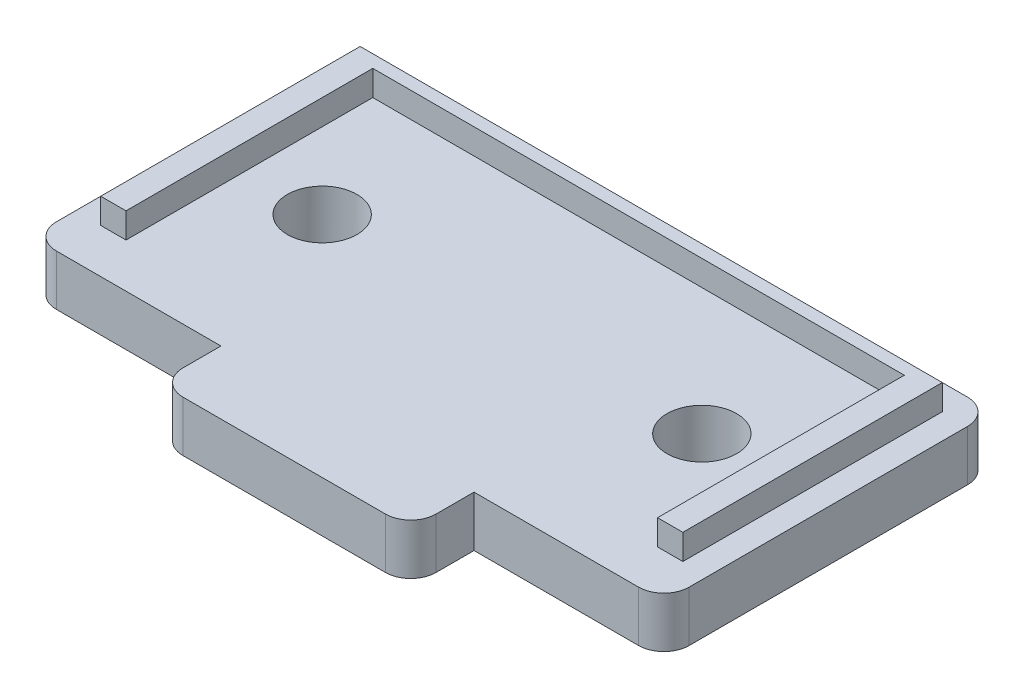
ISO-10303-21;
HEADER;
FILE_DESCRIPTION(('STEP AP214'),'2;1');
FILE_NAME('part.step','',(''),(''),'','','');
FILE_SCHEMA(('AUTOMOTIVE_DESIGN { 1 0 10303 214 1 1 1 1 }'));
ENDSEC;
DATA;
#1=APPLICATION_CONTEXT('core data for automotive mechanical design processes');
#2=APPLICATION_PROTOCOL_DEFINITION('international standard','automotive_design',2000,#1);
#3=PRODUCT_CONTEXT('',#1,'mechanical');
#4=PRODUCT('Part','Part','',(#3));
#5=PRODUCT_RELATED_PRODUCT_CATEGORY('part','',(#4));
#6=PRODUCT_DEFINITION_FORMATION('','',#4);
#7=PRODUCT_DEFINITION_CONTEXT('part definition',#1,'design');
#8=PRODUCT_DEFINITION('design','',#6,#7);
#9=PRODUCT_DEFINITION_SHAPE('','',#8);
#10=(LENGTH_UNIT() NAMED_UNIT(*) SI_UNIT(.MILLI.,.METRE.));
#11=(NAMED_UNIT(*) PLANE_ANGLE_UNIT() SI_UNIT($,.RADIAN.));
#12=(NAMED_UNIT(*) SI_UNIT($,.STERADIAN.) SOLID_ANGLE_UNIT());
#13=UNCERTAINTY_MEASURE_WITH_UNIT(LENGTH_MEASURE(1.E-05),#10,'distance_accuracy_value','');
#14=(GEOMETRIC_REPRESENTATION_CONTEXT(3) GLOBAL_UNCERTAINTY_ASSIGNED_CONTEXT((#13)) GLOBAL_UNIT_ASSIGNED_CONTEXT((#10,
#11,#12)) REPRESENTATION_CONTEXT('',''));
#15=CARTESIAN_POINT('',(0.,0.,0.));
#16=DIRECTION('',(0.,0.,1.));
#17=DIRECTION('',(1.,0.,0.));
#18=AXIS2_PLACEMENT_3D('',#15,#16,#17);
#19=CARTESIAN_POINT('',(0.,4.,0.));
#20=DIRECTION('',(0.,-1.,0.));
#21=DIRECTION('',(0.,0.,-1.));
#22=AXIS2_PLACEMENT_3D('',#19,#20,#21);
#23=PLANE('',#22);
#24=DIRECTION('',(0.,0.,1.));
#25=VECTOR('',#24,1.);
#26=CARTESIAN_POINT('',(-10.,4.,13.));
#27=LINE('',#26,#25);
#28=CARTESIAN_POINT('',(-10.,4.,13.));
#29=VERTEX_POINT('',#28);
#30=CARTESIAN_POINT('',(-10.,4.,16.));
#31=VERTEX_POINT('',#30);
#32=EDGE_CURVE('E250',#29,#31,#27,.T.);
#33=ORIENTED_EDGE('',*,*,#32,.T.);
#34=CARTESIAN_POINT('',(-8.,4.,16.));
#35=DIRECTION('',(0.,-1.,0.));
#36=DIRECTION('',(0.,0.,-1.));
#37=AXIS2_PLACEMENT_3D('',#34,#35,#36);
#38=CIRCLE('',#37,2.);
#39=CARTESIAN_POINT('',(-8.,4.,18.));
#40=VERTEX_POINT('',#39);
#41=EDGE_CURVE('E313',#31,#40,#38,.F.);
#42=ORIENTED_EDGE('',*,*,#41,.T.);
#43=DIRECTION('',(1.,0.,0.));
#44=VECTOR('',#43,1.);
#45=CARTESIAN_POINT('',(-10.,4.,18.));
#46=LINE('',#45,#44);
#47=CARTESIAN_POINT('',(8.,4.,18.));
#48=VERTEX_POINT('',#47);
#49=EDGE_CURVE('E253',#40,#48,#46,.T.);
#50=ORIENTED_EDGE('',*,*,#49,.T.);
#51=CARTESIAN_POINT('',(8.,4.,16.));
#52=DIRECTION('',(0.,-1.,0.));
#53=DIRECTION('',(0.,0.,-1.));
#54=AXIS2_PLACEMENT_3D('',#51,#52,#53);
#55=CIRCLE('',#54,2.);
#56=CARTESIAN_POINT('',(10.,4.,16.));
#57=VERTEX_POINT('',#56);
#58=EDGE_CURVE('E311',#48,#57,#55,.F.);
#59=ORIENTED_EDGE('',*,*,#58,.T.);
#60=DIRECTION('',(0.,0.,-1.));
#61=VECTOR('',#60,1.);
#62=CARTESIAN_POINT('',(10.,4.,13.));
#63=LINE('',#62,#61);
#64=CARTESIAN_POINT('',(10.,4.,13.));
#65=VERTEX_POINT('',#64);
#66=EDGE_CURVE('E256',#57,#65,#63,.T.);
#67=ORIENTED_EDGE('',*,*,#66,.T.);
#68=DIRECTION('',(1.,0.,0.));
#69=VECTOR('',#68,1.);
#70=CARTESIAN_POINT('',(10.,4.,13.));
#71=LINE('',#70,#69);
#72=CARTESIAN_POINT('',(23.,4.,13.));
#73=VERTEX_POINT('',#72);
#74=EDGE_CURVE('E235',#65,#73,#71,.T.);
#75=ORIENTED_EDGE('',*,*,#74,.T.);
#76=CARTESIAN_POINT('',(23.,4.,11.));
#77=DIRECTION('',(0.,-1.,0.));
#78=DIRECTION('',(0.,0.,-1.));
#79=AXIS2_PLACEMENT_3D('',#76,#77,#78);
#80=CIRCLE('',#79,2.);
#81=CARTESIAN_POINT('',(25.,4.,11.));
#82=VERTEX_POINT('',#81);
#83=EDGE_CURVE('E309',#73,#82,#80,.F.);
#84=ORIENTED_EDGE('',*,*,#83,.T.);
#85=DIRECTION('',(0.,0.,-1.));
#86=VECTOR('',#85,1.);
#87=CARTESIAN_POINT('',(25.,4.,-13.));
#88=LINE('',#87,#86);
#89=CARTESIAN_POINT('',(25.,4.,-11.));
#90=VERTEX_POINT('',#89);
#91=EDGE_CURVE('E238',#82,#90,#88,.T.);
#92=ORIENTED_EDGE('',*,*,#91,.T.);
#93=CARTESIAN_POINT('',(23.,4.,-11.));
#94=DIRECTION('',(0.,-1.,0.));
#95=DIRECTION('',(0.,0.,-1.));
#96=AXIS2_PLACEMENT_3D('',#93,#94,#95);
#97=CIRCLE('',#96,2.);
#98=CARTESIAN_POINT('',(23.,4.,-13.));
#99=VERTEX_POINT('',#98);
#100=EDGE_CURVE('E305',#90,#99,#97,.F.);
#101=ORIENTED_EDGE('',*,*,#100,.T.);
#102=DIRECTION('',(-1.,0.,0.));
#103=VECTOR('',#102,1.);
#104=CARTESIAN_POINT('',(-25.,4.,-13.));
#105=LINE('',#104,#103);
#106=CARTESIAN_POINT('',(-23.,4.,-13.));
#107=VERTEX_POINT('',#106);
#108=EDGE_CURVE('E242',#99,#107,#105,.T.);
#109=ORIENTED_EDGE('',*,*,#108,.T.);
#110=CARTESIAN_POINT('',(-23.,4.,-11.));
#111=DIRECTION('',(0.,-1.,0.));
#112=DIRECTION('',(0.,0.,-1.));
#113=AXIS2_PLACEMENT_3D('',#110,#111,#112);
#114=CIRCLE('',#113,2.);
#115=CARTESIAN_POINT('',(-25.,4.,-11.));
#116=VERTEX_POINT('',#115);
#117=EDGE_CURVE('E307',#107,#116,#114,.F.);
#118=ORIENTED_EDGE('',*,*,#117,.T.);
#119=DIRECTION('',(0.,0.,1.));
#120=VECTOR('',#119,1.);
#121=CARTESIAN_POINT('',(-25.,4.,-13.));
#122=LINE('',#121,#120);
#123=CARTESIAN_POINT('',(-25.,4.,11.));
#124=VERTEX_POINT('',#123);
#125=EDGE_CURVE('E245',#116,#124,#122,.T.);
#126=ORIENTED_EDGE('',*,*,#125,.T.);
#127=CARTESIAN_POINT('',(-23.,4.,11.));
#128=DIRECTION('',(0.,-1.,0.));
#129=DIRECTION('',(0.,0.,-1.));
#130=AXIS2_PLACEMENT_3D('',#127,#128,#129);
#131=CIRCLE('',#130,2.);
#132=CARTESIAN_POINT('',(-23.,4.,13.));
#133=VERTEX_POINT('',#132);
#134=EDGE_CURVE('E303',#124,#133,#131,.F.);
#135=ORIENTED_EDGE('',*,*,#134,.T.);
#136=DIRECTION('',(1.,0.,0.));
#137=VECTOR('',#136,1.);
#138=CARTESIAN_POINT('',(-25.,4.,13.));
#139=LINE('',#138,#137);
#140=EDGE_CURVE('E248',#133,#29,#139,.T.);
#141=ORIENTED_EDGE('',*,*,#140,.T.);
#142=EDGE_LOOP('',(#33,#42,#50,#59,#67,#75,#84,#92,#101,#109,#118,#126,#135,#141));
#143=FACE_BOUND('',#142,.T.);
#144=CARTESIAN_POINT('',(15.,4.,0.));
#145=DIRECTION('',(0.,1.,0.));
#146=DIRECTION('',(0.,0.,-1.));
#147=AXIS2_PLACEMENT_3D('',#144,#145,#146);
#148=CIRCLE('',#147,2.75);
#149=CARTESIAN_POINT('',(15.,4.,-2.75));
#150=VERTEX_POINT('',#149);
#151=EDGE_CURVE('E217',#150,#150,#148,.T.);
#152=ORIENTED_EDGE('',*,*,#151,.F.);
#153=EDGE_LOOP('',(#152));
#154=FACE_BOUND('',#153,.T.);
#155=CARTESIAN_POINT('',(-15.,4.,0.));
#156=DIRECTION('',(0.,1.,0.));
#157=DIRECTION('',(0.,0.,1.));
#158=AXIS2_PLACEMENT_3D('',#155,#156,#157);
#159=CIRCLE('',#158,2.75);
#160=CARTESIAN_POINT('',(-15.,4.,2.75));
#161=VERTEX_POINT('',#160);
#162=EDGE_CURVE('E226',#161,#161,#159,.T.);
#163=ORIENTED_EDGE('',*,*,#162,.F.);
#164=EDGE_LOOP('',(#163));
#165=FACE_BOUND('',#164,.T.);
#166=DIRECTION('',(1.,0.,0.));
#167=VECTOR('',#166,1.);
#168=CARTESIAN_POINT('',(23.,4.,9.5));
#169=LINE('',#168,#167);
#170=CARTESIAN_POINT('',(21.,4.,9.5));
#171=VERTEX_POINT('',#170);
#172=CARTESIAN_POINT('',(23.,4.,9.5));
#173=VERTEX_POINT('',#172);
#174=EDGE_CURVE('E216',#171,#173,#169,.T.);
#175=ORIENTED_EDGE('',*,*,#174,.F.);
#176=DIRECTION('',(0.,0.,1.));
#177=VECTOR('',#176,1.);
#178=CARTESIAN_POINT('',(21.,4.,9.5));
#179=LINE('',#178,#177);
#180=CARTESIAN_POINT('',(21.,4.,-10.));
#181=VERTEX_POINT('',#180);
#182=EDGE_CURVE('E213',#181,#171,#179,.T.);
#183=ORIENTED_EDGE('',*,*,#182,.F.);
#184=DIRECTION('',(1.,0.,0.));
#185=VECTOR('',#184,1.);
#186=CARTESIAN_POINT('',(-8.5,4.,-10.));
#187=LINE('',#186,#185);
#188=CARTESIAN_POINT('',(-21.,4.,-10.));
#189=VERTEX_POINT('',#188);
#190=EDGE_CURVE('E583',#189,#181,#187,.T.);
#191=ORIENTED_EDGE('',*,*,#190,.F.);
#192=DIRECTION('',(0.,0.,-1.));
#193=VECTOR('',#192,1.);
#194=CARTESIAN_POINT('',(-21.,4.,-10.));
#195=LINE('',#194,#193);
#196=CARTESIAN_POINT('',(-21.,4.,9.5));
#197=VERTEX_POINT('',#196);
#198=EDGE_CURVE('E614',#197,#189,#195,.T.);
#199=ORIENTED_EDGE('',*,*,#198,.F.);
#200=DIRECTION('',(1.,0.,0.));
#201=VECTOR('',#200,1.);
#202=CARTESIAN_POINT('',(-21.,4.,9.5));
#203=LINE('',#202,#201);
#204=CARTESIAN_POINT('',(-23.,4.,9.50000000000001));
#205=VERTEX_POINT('',#204);
#206=EDGE_CURVE('E607',#205,#197,#203,.T.);
#207=ORIENTED_EDGE('',*,*,#206,.F.);
#208=DIRECTION('',(0.,0.,1.));
#209=VECTOR('',#208,1.);
#210=CARTESIAN_POINT('',(-23.,4.,9.50000000000001));
#211=LINE('',#210,#209);
#212=CARTESIAN_POINT('',(-23.,4.,-11.));
#213=VERTEX_POINT('',#212);
#214=EDGE_CURVE('E604',#213,#205,#211,.T.);
#215=ORIENTED_EDGE('',*,*,#214,.F.);
#216=DIRECTION('',(-1.,0.,0.));
#217=VECTOR('',#216,1.);
#218=CARTESIAN_POINT('',(-23.,4.,-11.));
#219=LINE('',#218,#217);
#220=CARTESIAN_POINT('',(23.,4.,-11.));
#221=VERTEX_POINT('',#220);
#222=EDGE_CURVE('E67',#221,#213,#219,.T.);
#223=ORIENTED_EDGE('',*,*,#222,.F.);
#224=DIRECTION('',(0.,0.,-1.));
#225=VECTOR('',#224,1.);
#226=CARTESIAN_POINT('',(23.,4.,-11.));
#227=LINE('',#226,#225);
#228=EDGE_CURVE('E62',#173,#221,#227,.T.);
#229=ORIENTED_EDGE('',*,*,#228,.F.);
#230=EDGE_LOOP('',(#175,#183,#191,#199,#207,#215,#223,#229));
#231=FACE_BOUND('',#230,.T.);
#232=ADVANCED_FACE('F47',(#143,#154,#165,#231),#23,.F.);
#233=CARTESIAN_POINT('',(10.,4.,13.));
#234=DIRECTION('',(0.,0.,-1.));
#235=DIRECTION('',(-1.,0.,0.));
#236=AXIS2_PLACEMENT_3D('',#233,#234,#235);
#237=PLANE('',#236);
#238=DIRECTION('',(1.,0.,0.));
#239=VECTOR('',#238,1.);
#240=CARTESIAN_POINT('',(10.,0.,13.));
#241=LINE('',#240,#239);
#242=CARTESIAN_POINT('',(10.,0.,13.));
#243=VERTEX_POINT('',#242);
#244=CARTESIAN_POINT('',(23.,0.,13.));
#245=VERTEX_POINT('',#244);
#246=EDGE_CURVE('E229',#243,#245,#241,.T.);
#247=ORIENTED_EDGE('',*,*,#246,.T.);
#248=DIRECTION('',(0.,-1.,0.));
#249=VECTOR('',#248,1.);
#250=CARTESIAN_POINT('',(23.,4.,13.));
#251=LINE('',#250,#249);
#252=EDGE_CURVE('E323',#245,#73,#251,.F.);
#253=ORIENTED_EDGE('',*,*,#252,.T.);
#254=ORIENTED_EDGE('',*,*,#74,.F.);
#255=DIRECTION('',(0.,-1.,0.));
#256=VECTOR('',#255,1.);
#257=CARTESIAN_POINT('',(10.,4.,13.));
#258=LINE('',#257,#256);
#259=EDGE_CURVE('E258',#65,#243,#258,.T.);
#260=ORIENTED_EDGE('',*,*,#259,.T.);
#261=EDGE_LOOP('',(#247,#253,#254,#260));
#262=FACE_BOUND('',#261,.T.);
#263=ADVANCED_FACE('F405',(#262),#237,.F.);
#264=CARTESIAN_POINT('',(25.,4.,-13.));
#265=DIRECTION('',(-1.,0.,0.));
#266=DIRECTION('',(0.,0.,1.));
#267=AXIS2_PLACEMENT_3D('',#264,#265,#266);
#268=PLANE('',#267);
#269=ORIENTED_EDGE('',*,*,#91,.F.);
#270=DIRECTION('',(0.,-1.,0.));
#271=VECTOR('',#270,1.);
#272=CARTESIAN_POINT('',(25.,4.,11.));
#273=LINE('',#272,#271);
#274=CARTESIAN_POINT('',(25.,0.,11.));
#275=VERTEX_POINT('',#274);
#276=EDGE_CURVE('E320',#82,#275,#273,.T.);
#277=ORIENTED_EDGE('',*,*,#276,.T.);
#278=DIRECTION('',(0.,0.,-1.));
#279=VECTOR('',#278,1.);
#280=CARTESIAN_POINT('',(25.,0.,-13.));
#281=LINE('',#280,#279);
#282=CARTESIAN_POINT('',(25.,0.,-11.));
#283=VERTEX_POINT('',#282);
#284=EDGE_CURVE('E261',#275,#283,#281,.T.);
#285=ORIENTED_EDGE('',*,*,#284,.T.);
#286=DIRECTION('',(0.,-1.,0.));
#287=VECTOR('',#286,1.);
#288=CARTESIAN_POINT('',(25.,4.,-11.));
#289=LINE('',#288,#287);
#290=EDGE_CURVE('E318',#283,#90,#289,.F.);
#291=ORIENTED_EDGE('',*,*,#290,.T.);
#292=EDGE_LOOP('',(#269,#277,#285,#291));
#293=FACE_BOUND('',#292,.T.);
#294=ADVANCED_FACE('F393',(#293),#268,.F.);
#295=CARTESIAN_POINT('',(-25.,4.,-13.));
#296=DIRECTION('',(0.,0.,1.));
#297=DIRECTION('',(1.,0.,0.));
#298=AXIS2_PLACEMENT_3D('',#295,#296,#297);
#299=PLANE('',#298);
#300=DIRECTION('',(-1.,0.,0.));
#301=VECTOR('',#300,1.);
#302=CARTESIAN_POINT('',(-25.,0.,-13.));
#303=LINE('',#302,#301);
#304=CARTESIAN_POINT('',(23.,0.,-13.));
#305=VERTEX_POINT('',#304);
#306=CARTESIAN_POINT('',(-23.,0.,-13.));
#307=VERTEX_POINT('',#306);
#308=EDGE_CURVE('E264',#305,#307,#303,.T.);
#309=ORIENTED_EDGE('',*,*,#308,.T.);
#310=DIRECTION('',(0.,-1.,0.));
#311=VECTOR('',#310,1.);
#312=CARTESIAN_POINT('',(-23.,4.,-13.));
#313=LINE('',#312,#311);
#314=EDGE_CURVE('E55',#307,#107,#313,.F.);
#315=ORIENTED_EDGE('',*,*,#314,.T.);
#316=ORIENTED_EDGE('',*,*,#108,.F.);
#317=DIRECTION('',(0.,-1.,0.));
#318=VECTOR('',#317,1.);
#319=CARTESIAN_POINT('',(23.,4.,-13.));
#320=LINE('',#319,#318);
#321=EDGE_CURVE('E330',#99,#305,#320,.T.);
#322=ORIENTED_EDGE('',*,*,#321,.T.);
#323=EDGE_LOOP('',(#309,#315,#316,#322));
#324=FACE_BOUND('',#323,.T.);
#325=ADVANCED_FACE('F335',(#324),#299,.F.);
#326=CARTESIAN_POINT('',(-25.,4.,-13.));
#327=DIRECTION('',(1.,0.,0.));
#328=DIRECTION('',(0.,0.,-1.));
#329=AXIS2_PLACEMENT_3D('',#326,#327,#328);
#330=PLANE('',#329);
#331=ORIENTED_EDGE('',*,*,#125,.F.);
#332=DIRECTION('',(0.,-1.,0.));
#333=VECTOR('',#332,1.);
#334=CARTESIAN_POINT('',(-25.,4.,-11.));
#335=LINE('',#334,#333);
#336=CARTESIAN_POINT('',(-25.,0.,-11.));
#337=VERTEX_POINT('',#336);
#338=EDGE_CURVE('E327',#116,#337,#335,.T.);
#339=ORIENTED_EDGE('',*,*,#338,.T.);
#340=DIRECTION('',(0.,0.,1.));
#341=VECTOR('',#340,1.);
#342=CARTESIAN_POINT('',(-25.,0.,-13.));
#343=LINE('',#342,#341);
#344=CARTESIAN_POINT('',(-25.,0.,11.));
#345=VERTEX_POINT('',#344);
#346=EDGE_CURVE('E267',#337,#345,#343,.T.);
#347=ORIENTED_EDGE('',*,*,#346,.T.);
#348=DIRECTION('',(0.,-1.,0.));
#349=VECTOR('',#348,1.);
#350=CARTESIAN_POINT('',(-25.,4.,11.));
#351=LINE('',#350,#349);
#352=EDGE_CURVE('E325',#345,#124,#351,.F.);
#353=ORIENTED_EDGE('',*,*,#352,.T.);
#354=EDGE_LOOP('',(#331,#339,#347,#353));
#355=FACE_BOUND('',#354,.T.);
#356=ADVANCED_FACE('F348',(#355),#330,.F.);
#357=CARTESIAN_POINT('',(-25.,4.,13.));
#358=DIRECTION('',(0.,0.,-1.));
#359=DIRECTION('',(-1.,0.,0.));
#360=AXIS2_PLACEMENT_3D('',#357,#358,#359);
#361=PLANE('',#360);
#362=ORIENTED_EDGE('',*,*,#140,.F.);
#363=DIRECTION('',(0.,-1.,0.));
#364=VECTOR('',#363,1.);
#365=CARTESIAN_POINT('',(-23.,4.,13.));
#366=LINE('',#365,#364);
#367=CARTESIAN_POINT('',(-23.,0.,13.));
#368=VERTEX_POINT('',#367);
#369=EDGE_CURVE('E11',#133,#368,#366,.T.);
#370=ORIENTED_EDGE('',*,*,#369,.T.);
#371=DIRECTION('',(1.,0.,0.));
#372=VECTOR('',#371,1.);
#373=CARTESIAN_POINT('',(-25.,0.,13.));
#374=LINE('',#373,#372);
#375=CARTESIAN_POINT('',(-10.,0.,13.));
#376=VERTEX_POINT('',#375);
#377=EDGE_CURVE('E270',#368,#376,#374,.T.);
#378=ORIENTED_EDGE('',*,*,#377,.T.);
#379=DIRECTION('',(0.,-1.,0.));
#380=VECTOR('',#379,1.);
#381=CARTESIAN_POINT('',(-10.,4.,13.));
#382=LINE('',#381,#380);
#383=EDGE_CURVE('E281',#29,#376,#382,.T.);
#384=ORIENTED_EDGE('',*,*,#383,.F.);
#385=EDGE_LOOP('',(#362,#370,#378,#384));
#386=FACE_BOUND('',#385,.T.);
#387=ADVANCED_FACE('F360',(#386),#361,.F.);
#388=CARTESIAN_POINT('',(-10.,4.,13.));
#389=DIRECTION('',(1.,0.,0.));
#390=DIRECTION('',(0.,0.,-1.));
#391=AXIS2_PLACEMENT_3D('',#388,#389,#390);
#392=PLANE('',#391);
#393=DIRECTION('',(0.,0.,1.));
#394=VECTOR('',#393,1.);
#395=CARTESIAN_POINT('',(-10.,0.,13.));
#396=LINE('',#395,#394);
#397=CARTESIAN_POINT('',(-10.,0.,16.));
#398=VERTEX_POINT('',#397);
#399=EDGE_CURVE('E272',#376,#398,#396,.T.);
#400=ORIENTED_EDGE('',*,*,#399,.T.);
#401=DIRECTION('',(0.,-1.,0.));
#402=VECTOR('',#401,1.);
#403=CARTESIAN_POINT('',(-10.,4.,16.));
#404=LINE('',#403,#402);
#405=EDGE_CURVE('E301',#398,#31,#404,.F.);
#406=ORIENTED_EDGE('',*,*,#405,.T.);
#407=ORIENTED_EDGE('',*,*,#32,.F.);
#408=ORIENTED_EDGE('',*,*,#383,.T.);
#409=EDGE_LOOP('',(#400,#406,#407,#408));
#410=FACE_BOUND('',#409,.T.);
#411=ADVANCED_FACE('F423',(#410),#392,.F.);
#412=CARTESIAN_POINT('',(-10.,4.,18.));
#413=DIRECTION('',(0.,0.,-1.));
#414=DIRECTION('',(-1.,0.,0.));
#415=AXIS2_PLACEMENT_3D('',#412,#413,#414);
#416=PLANE('',#415);
#417=ORIENTED_EDGE('',*,*,#49,.F.);
#418=DIRECTION('',(0.,-1.,0.));
#419=VECTOR('',#418,1.);
#420=CARTESIAN_POINT('',(-8.,4.,18.));
#421=LINE('',#420,#419);
#422=CARTESIAN_POINT('',(-8.,0.,18.));
#423=VERTEX_POINT('',#422);
#424=EDGE_CURVE('E286',#40,#423,#421,.T.);
#425=ORIENTED_EDGE('',*,*,#424,.T.);
#426=DIRECTION('',(1.,0.,0.));
#427=VECTOR('',#426,1.);
#428=CARTESIAN_POINT('',(-10.,0.,18.));
#429=LINE('',#428,#427);
#430=CARTESIAN_POINT('',(8.,0.,18.));
#431=VERTEX_POINT('',#430);
#432=EDGE_CURVE('E275',#423,#431,#429,.T.);
#433=ORIENTED_EDGE('',*,*,#432,.T.);
#434=DIRECTION('',(0.,-1.,0.));
#435=VECTOR('',#434,1.);
#436=CARTESIAN_POINT('',(8.,4.,18.));
#437=LINE('',#436,#435);
#438=EDGE_CURVE('E284',#431,#48,#437,.F.);
#439=ORIENTED_EDGE('',*,*,#438,.T.);
#440=EDGE_LOOP('',(#417,#425,#433,#439));
#441=FACE_BOUND('',#440,.T.);
#442=ADVANCED_FACE('F371',(#441),#416,.F.);
#443=CARTESIAN_POINT('',(10.,4.,13.));
#444=DIRECTION('',(-1.,0.,0.));
#445=DIRECTION('',(0.,0.,1.));
#446=AXIS2_PLACEMENT_3D('',#443,#444,#445);
#447=PLANE('',#446);
#448=ORIENTED_EDGE('',*,*,#66,.F.);
#449=DIRECTION('',(0.,-1.,0.));
#450=VECTOR('',#449,1.);
#451=CARTESIAN_POINT('',(10.,4.,16.));
#452=LINE('',#451,#450);
#453=CARTESIAN_POINT('',(10.,0.,16.));
#454=VERTEX_POINT('',#453);
#455=EDGE_CURVE('E315',#57,#454,#452,.T.);
#456=ORIENTED_EDGE('',*,*,#455,.T.);
#457=DIRECTION('',(0.,0.,-1.));
#458=VECTOR('',#457,1.);
#459=CARTESIAN_POINT('',(10.,0.,13.));
#460=LINE('',#459,#458);
#461=EDGE_CURVE('E239',#454,#243,#460,.T.);
#462=ORIENTED_EDGE('',*,*,#461,.T.);
#463=ORIENTED_EDGE('',*,*,#259,.F.);
#464=EDGE_LOOP('',(#448,#456,#462,#463));
#465=FACE_BOUND('',#464,.T.);
#466=ADVANCED_FACE('F381',(#465),#447,.F.);
#467=CARTESIAN_POINT('',(0.,0.,0.));
#468=DIRECTION('',(0.,-1.,0.));
#469=DIRECTION('',(0.,0.,-1.));
#470=AXIS2_PLACEMENT_3D('',#467,#468,#469);
#471=PLANE('',#470);
#472=CARTESIAN_POINT('',(-15.,0.,0.));
#473=DIRECTION('',(0.,-1.,0.));
#474=DIRECTION('',(0.,0.,-1.));
#475=AXIS2_PLACEMENT_3D('',#472,#473,#474);
#476=CIRCLE('',#475,2.75);
#477=CARTESIAN_POINT('',(-15.,0.,-2.75));
#478=VERTEX_POINT('',#477);
#479=EDGE_CURVE('E230',#478,#478,#476,.F.);
#480=ORIENTED_EDGE('',*,*,#479,.T.);
#481=EDGE_LOOP('',(#480));
#482=FACE_BOUND('',#481,.T.);
#483=CARTESIAN_POINT('',(15.,0.,0.));
#484=DIRECTION('',(0.,-1.,0.));
#485=DIRECTION('',(0.,0.,-1.));
#486=AXIS2_PLACEMENT_3D('',#483,#484,#485);
#487=CIRCLE('',#486,2.75);
#488=CARTESIAN_POINT('',(15.,0.,-2.75));
#489=VERTEX_POINT('',#488);
#490=EDGE_CURVE('E220',#489,#489,#487,.F.);
#491=ORIENTED_EDGE('',*,*,#490,.T.);
#492=EDGE_LOOP('',(#491));
#493=FACE_BOUND('',#492,.T.);
#494=ORIENTED_EDGE('',*,*,#432,.F.);
#495=CARTESIAN_POINT('',(-8.,0.,16.));
#496=DIRECTION('',(0.,-1.,0.));
#497=DIRECTION('',(0.,0.,-1.));
#498=AXIS2_PLACEMENT_3D('',#495,#496,#497);
#499=CIRCLE('',#498,2.);
#500=EDGE_CURVE('E299',#423,#398,#499,.T.);
#501=ORIENTED_EDGE('',*,*,#500,.T.);
#502=ORIENTED_EDGE('',*,*,#399,.F.);
#503=ORIENTED_EDGE('',*,*,#377,.F.);
#504=CARTESIAN_POINT('',(-23.,0.,11.));
#505=DIRECTION('',(0.,-1.,0.));
#506=DIRECTION('',(0.,0.,-1.));
#507=AXIS2_PLACEMENT_3D('',#504,#505,#506);
#508=CIRCLE('',#507,2.);
#509=EDGE_CURVE('E289',#368,#345,#508,.T.);
#510=ORIENTED_EDGE('',*,*,#509,.T.);
#511=ORIENTED_EDGE('',*,*,#346,.F.);
#512=CARTESIAN_POINT('',(-23.,0.,-11.));
#513=DIRECTION('',(0.,-1.,0.));
#514=DIRECTION('',(0.,0.,-1.));
#515=AXIS2_PLACEMENT_3D('',#512,#513,#514);
#516=CIRCLE('',#515,2.);
#517=EDGE_CURVE('E293',#337,#307,#516,.T.);
#518=ORIENTED_EDGE('',*,*,#517,.T.);
#519=ORIENTED_EDGE('',*,*,#308,.F.);
#520=CARTESIAN_POINT('',(23.,0.,-11.));
#521=DIRECTION('',(0.,-1.,0.));
#522=DIRECTION('',(0.,0.,-1.));
#523=AXIS2_PLACEMENT_3D('',#520,#521,#522);
#524=CIRCLE('',#523,2.);
#525=EDGE_CURVE('E291',#305,#283,#524,.T.);
#526=ORIENTED_EDGE('',*,*,#525,.T.);
#527=ORIENTED_EDGE('',*,*,#284,.F.);
#528=CARTESIAN_POINT('',(23.,0.,11.));
#529=DIRECTION('',(0.,-1.,0.));
#530=DIRECTION('',(0.,0.,-1.));
#531=AXIS2_PLACEMENT_3D('',#528,#529,#530);
#532=CIRCLE('',#531,2.);
#533=EDGE_CURVE('E295',#275,#245,#532,.T.);
#534=ORIENTED_EDGE('',*,*,#533,.T.);
#535=ORIENTED_EDGE('',*,*,#246,.F.);
#536=ORIENTED_EDGE('',*,*,#461,.F.);
#537=CARTESIAN_POINT('',(8.,0.,16.));
#538=DIRECTION('',(0.,-1.,0.));
#539=DIRECTION('',(0.,0.,-1.));
#540=AXIS2_PLACEMENT_3D('',#537,#538,#539);
#541=CIRCLE('',#540,2.);
#542=EDGE_CURVE('E297',#454,#431,#541,.T.);
#543=ORIENTED_EDGE('',*,*,#542,.T.);
#544=EDGE_LOOP('',(#494,#501,#502,#503,#510,#511,#518,#519,#526,#527,#534,#535,#536,#543));
#545=FACE_BOUND('',#544,.T.);
#546=ADVANCED_FACE('F352',(#482,#493,#545),#471,.T.);
#547=CARTESIAN_POINT('',(-8.,4.,16.));
#548=DIRECTION('',(0.,-1.,0.));
#549=DIRECTION('',(0.,0.,-1.));
#550=AXIS2_PLACEMENT_3D('',#547,#548,#549);
#551=CYLINDRICAL_SURFACE('',#550,2.);
#552=ORIENTED_EDGE('',*,*,#41,.F.);
#553=ORIENTED_EDGE('',*,*,#405,.F.);
#554=ORIENTED_EDGE('',*,*,#500,.F.);
#555=ORIENTED_EDGE('',*,*,#424,.F.);
#556=EDGE_LOOP('',(#552,#553,#554,#555));
#557=FACE_BOUND('',#556,.T.);
#558=ADVANCED_FACE('F369',(#557),#551,.T.);
#559=CARTESIAN_POINT('',(8.,4.,16.));
#560=DIRECTION('',(0.,-1.,0.));
#561=DIRECTION('',(0.,0.,-1.));
#562=AXIS2_PLACEMENT_3D('',#559,#560,#561);
#563=CYLINDRICAL_SURFACE('',#562,2.);
#564=ORIENTED_EDGE('',*,*,#58,.F.);
#565=ORIENTED_EDGE('',*,*,#438,.F.);
#566=ORIENTED_EDGE('',*,*,#542,.F.);
#567=ORIENTED_EDGE('',*,*,#455,.F.);
#568=EDGE_LOOP('',(#564,#565,#566,#567));
#569=FACE_BOUND('',#568,.T.);
#570=ADVANCED_FACE('F378',(#569),#563,.T.);
#571=CARTESIAN_POINT('',(23.,4.,11.));
#572=DIRECTION('',(0.,-1.,0.));
#573=DIRECTION('',(0.,0.,-1.));
#574=AXIS2_PLACEMENT_3D('',#571,#572,#573);
#575=CYLINDRICAL_SURFACE('',#574,2.);
#576=ORIENTED_EDGE('',*,*,#83,.F.);
#577=ORIENTED_EDGE('',*,*,#252,.F.);
#578=ORIENTED_EDGE('',*,*,#533,.F.);
#579=ORIENTED_EDGE('',*,*,#276,.F.);
#580=EDGE_LOOP('',(#576,#577,#578,#579));
#581=FACE_BOUND('',#580,.T.);
#582=ADVANCED_FACE('F390',(#581),#575,.T.);
#583=CARTESIAN_POINT('',(-23.,4.,-11.));
#584=DIRECTION('',(0.,-1.,0.));
#585=DIRECTION('',(0.,0.,-1.));
#586=AXIS2_PLACEMENT_3D('',#583,#584,#585);
#587=CYLINDRICAL_SURFACE('',#586,2.);
#588=ORIENTED_EDGE('',*,*,#117,.F.);
#589=ORIENTED_EDGE('',*,*,#314,.F.);
#590=ORIENTED_EDGE('',*,*,#517,.F.);
#591=ORIENTED_EDGE('',*,*,#338,.F.);
#592=EDGE_LOOP('',(#588,#589,#590,#591));
#593=FACE_BOUND('',#592,.T.);
#594=ADVANCED_FACE('F345',(#593),#587,.T.);
#595=CARTESIAN_POINT('',(23.,4.,-11.));
#596=DIRECTION('',(0.,-1.,0.));
#597=DIRECTION('',(0.,0.,-1.));
#598=AXIS2_PLACEMENT_3D('',#595,#596,#597);
#599=CYLINDRICAL_SURFACE('',#598,2.);
#600=ORIENTED_EDGE('',*,*,#100,.F.);
#601=ORIENTED_EDGE('',*,*,#290,.F.);
#602=ORIENTED_EDGE('',*,*,#525,.F.);
#603=ORIENTED_EDGE('',*,*,#321,.F.);
#604=EDGE_LOOP('',(#600,#601,#602,#603));
#605=FACE_BOUND('',#604,.T.);
#606=ADVANCED_FACE('F396',(#605),#599,.T.);
#607=CARTESIAN_POINT('',(-23.,4.,11.));
#608=DIRECTION('',(0.,-1.,0.));
#609=DIRECTION('',(0.,0.,-1.));
#610=AXIS2_PLACEMENT_3D('',#607,#608,#609);
#611=CYLINDRICAL_SURFACE('',#610,2.);
#612=ORIENTED_EDGE('',*,*,#134,.F.);
#613=ORIENTED_EDGE('',*,*,#352,.F.);
#614=ORIENTED_EDGE('',*,*,#509,.F.);
#615=ORIENTED_EDGE('',*,*,#369,.F.);
#616=EDGE_LOOP('',(#612,#613,#614,#615));
#617=FACE_BOUND('',#616,.T.);
#618=ADVANCED_FACE('F49',(#617),#611,.T.);
#619=CARTESIAN_POINT('',(15.,-0.00100000000000013,0.));
#620=DIRECTION('',(0.,1.,0.));
#621=DIRECTION('',(0.,0.,1.));
#622=AXIS2_PLACEMENT_3D('',#619,#620,#621);
#623=CYLINDRICAL_SURFACE('',#622,2.75);
#624=ORIENTED_EDGE('',*,*,#490,.F.);
#625=EDGE_LOOP('',(#624));
#626=FACE_BOUND('',#625,.T.);
#627=ORIENTED_EDGE('',*,*,#151,.T.);
#628=EDGE_LOOP('',(#627));
#629=FACE_BOUND('',#628,.T.);
#630=ADVANCED_FACE('F402',(#626,#629),#623,.F.);
#631=CARTESIAN_POINT('',(-15.,-0.00100000000000013,0.));
#632=DIRECTION('',(0.,1.,0.));
#633=DIRECTION('',(0.,0.,1.));
#634=AXIS2_PLACEMENT_3D('',#631,#632,#633);
#635=CYLINDRICAL_SURFACE('',#634,2.75);
#636=ORIENTED_EDGE('',*,*,#479,.F.);
#637=EDGE_LOOP('',(#636));
#638=FACE_BOUND('',#637,.T.);
#639=ORIENTED_EDGE('',*,*,#162,.T.);
#640=EDGE_LOOP('',(#639));
#641=FACE_BOUND('',#640,.T.);
#642=ADVANCED_FACE('F468',(#638,#641),#635,.F.);
#643=CARTESIAN_POINT('',(23.,6.,9.5));
#644=DIRECTION('',(0.,0.,-1.));
#645=DIRECTION('',(-1.,0.,0.));
#646=AXIS2_PLACEMENT_3D('',#643,#644,#645);
#647=PLANE('',#646);
#648=ORIENTED_EDGE('',*,*,#174,.T.);
#649=DIRECTION('',(0.,-1.,0.));
#650=VECTOR('',#649,1.);
#651=CARTESIAN_POINT('',(23.,6.,9.5));
#652=LINE('',#651,#650);
#653=CARTESIAN_POINT('',(23.,6.,9.5));
#654=VERTEX_POINT('',#653);
#655=EDGE_CURVE('E197',#654,#173,#652,.T.);
#656=ORIENTED_EDGE('',*,*,#655,.F.);
#657=DIRECTION('',(1.,0.,0.));
#658=VECTOR('',#657,1.);
#659=CARTESIAN_POINT('',(23.,6.,9.5));
#660=LINE('',#659,#658);
#661=CARTESIAN_POINT('',(21.,6.,9.5));
#662=VERTEX_POINT('',#661);
#663=EDGE_CURVE('E204',#662,#654,#660,.T.);
#664=ORIENTED_EDGE('',*,*,#663,.F.);
#665=DIRECTION('',(0.,-1.,0.));
#666=VECTOR('',#665,1.);
#667=CARTESIAN_POINT('',(21.,6.,9.5));
#668=LINE('',#667,#666);
#669=EDGE_CURVE('E579',#662,#171,#668,.T.);
#670=ORIENTED_EDGE('',*,*,#669,.T.);
#671=EDGE_LOOP('',(#648,#656,#664,#670));
#672=FACE_BOUND('',#671,.T.);
#673=ADVANCED_FACE('F215',(#672),#647,.F.);
#674=CARTESIAN_POINT('',(23.,6.,-11.));
#675=DIRECTION('',(-1.,0.,0.));
#676=DIRECTION('',(0.,0.,1.));
#677=AXIS2_PLACEMENT_3D('',#674,#675,#676);
#678=PLANE('',#677);
#679=ORIENTED_EDGE('',*,*,#228,.T.);
#680=DIRECTION('',(0.,-1.,0.));
#681=VECTOR('',#680,1.);
#682=CARTESIAN_POINT('',(23.,6.,-11.));
#683=LINE('',#682,#681);
#684=CARTESIAN_POINT('',(23.,6.,-11.));
#685=VERTEX_POINT('',#684);
#686=EDGE_CURVE('E200',#685,#221,#683,.T.);
#687=ORIENTED_EDGE('',*,*,#686,.F.);
#688=DIRECTION('',(0.,0.,-1.));
#689=VECTOR('',#688,1.);
#690=CARTESIAN_POINT('',(23.,6.,-11.));
#691=LINE('',#690,#689);
#692=EDGE_CURVE('E193',#654,#685,#691,.T.);
#693=ORIENTED_EDGE('',*,*,#692,.F.);
#694=ORIENTED_EDGE('',*,*,#655,.T.);
#695=EDGE_LOOP('',(#679,#687,#693,#694));
#696=FACE_BOUND('',#695,.T.);
#697=ADVANCED_FACE('F195',(#696),#678,.F.);
#698=CARTESIAN_POINT('',(-23.,6.,-11.));
#699=DIRECTION('',(0.,0.,1.));
#700=DIRECTION('',(1.,0.,0.));
#701=AXIS2_PLACEMENT_3D('',#698,#699,#700);
#702=PLANE('',#701);
#703=ORIENTED_EDGE('',*,*,#222,.T.);
#704=DIRECTION('',(0.,-1.,0.));
#705=VECTOR('',#704,1.);
#706=CARTESIAN_POINT('',(-23.,6.,-11.));
#707=LINE('',#706,#705);
#708=CARTESIAN_POINT('',(-23.,6.,-11.));
#709=VERTEX_POINT('',#708);
#710=EDGE_CURVE('E222',#709,#213,#707,.T.);
#711=ORIENTED_EDGE('',*,*,#710,.F.);
#712=DIRECTION('',(-1.,0.,0.));
#713=VECTOR('',#712,1.);
#714=CARTESIAN_POINT('',(-23.,6.,-11.));
#715=LINE('',#714,#713);
#716=EDGE_CURVE('E203',#685,#709,#715,.T.);
#717=ORIENTED_EDGE('',*,*,#716,.F.);
#718=ORIENTED_EDGE('',*,*,#686,.T.);
#719=EDGE_LOOP('',(#703,#711,#717,#718));
#720=FACE_BOUND('',#719,.T.);
#721=ADVANCED_FACE('F495',(#720),#702,.F.);
#722=CARTESIAN_POINT('',(-23.,6.,9.50000000000001));
#723=DIRECTION('',(1.,0.,0.));
#724=DIRECTION('',(0.,0.,-1.));
#725=AXIS2_PLACEMENT_3D('',#722,#723,#724);
#726=PLANE('',#725);
#727=ORIENTED_EDGE('',*,*,#214,.T.);
#728=DIRECTION('',(0.,-1.,0.));
#729=VECTOR('',#728,1.);
#730=CARTESIAN_POINT('',(-23.,6.,9.50000000000001));
#731=LINE('',#730,#729);
#732=CARTESIAN_POINT('',(-23.,6.,9.50000000000001));
#733=VERTEX_POINT('',#732);
#734=EDGE_CURVE('E597',#733,#205,#731,.T.);
#735=ORIENTED_EDGE('',*,*,#734,.F.);
#736=DIRECTION('',(0.,0.,1.));
#737=VECTOR('',#736,1.);
#738=CARTESIAN_POINT('',(-23.,6.,9.50000000000001));
#739=LINE('',#738,#737);
#740=EDGE_CURVE('E605',#709,#733,#739,.T.);
#741=ORIENTED_EDGE('',*,*,#740,.F.);
#742=ORIENTED_EDGE('',*,*,#710,.T.);
#743=EDGE_LOOP('',(#727,#735,#741,#742));
#744=FACE_BOUND('',#743,.T.);
#745=ADVANCED_FACE('F504',(#744),#726,.F.);
#746=CARTESIAN_POINT('',(-21.,6.,9.5));
#747=DIRECTION('',(0.,0.,-1.));
#748=DIRECTION('',(-1.,0.,0.));
#749=AXIS2_PLACEMENT_3D('',#746,#747,#748);
#750=PLANE('',#749);
#751=ORIENTED_EDGE('',*,*,#206,.T.);
#752=DIRECTION('',(0.,-1.,0.));
#753=VECTOR('',#752,1.);
#754=CARTESIAN_POINT('',(-21.,6.,9.5));
#755=LINE('',#754,#753);
#756=CARTESIAN_POINT('',(-21.,6.,9.5));
#757=VERTEX_POINT('',#756);
#758=EDGE_CURVE('E594',#757,#197,#755,.T.);
#759=ORIENTED_EDGE('',*,*,#758,.F.);
#760=DIRECTION('',(1.,0.,0.));
#761=VECTOR('',#760,1.);
#762=CARTESIAN_POINT('',(-21.,6.,9.5));
#763=LINE('',#762,#761);
#764=EDGE_CURVE('E622',#733,#757,#763,.T.);
#765=ORIENTED_EDGE('',*,*,#764,.F.);
#766=ORIENTED_EDGE('',*,*,#734,.T.);
#767=EDGE_LOOP('',(#751,#759,#765,#766));
#768=FACE_BOUND('',#767,.T.);
#769=ADVANCED_FACE('F514',(#768),#750,.F.);
#770=CARTESIAN_POINT('',(-21.,6.,-10.));
#771=DIRECTION('',(-1.,0.,0.));
#772=DIRECTION('',(0.,0.,1.));
#773=AXIS2_PLACEMENT_3D('',#770,#771,#772);
#774=PLANE('',#773);
#775=ORIENTED_EDGE('',*,*,#198,.T.);
#776=DIRECTION('',(0.,-1.,0.));
#777=VECTOR('',#776,1.);
#778=CARTESIAN_POINT('',(-21.,6.,-10.));
#779=LINE('',#778,#777);
#780=CARTESIAN_POINT('',(-21.,6.,-10.));
#781=VERTEX_POINT('',#780);
#782=EDGE_CURVE('E586',#781,#189,#779,.T.);
#783=ORIENTED_EDGE('',*,*,#782,.F.);
#784=DIRECTION('',(0.,0.,-1.));
#785=VECTOR('',#784,1.);
#786=CARTESIAN_POINT('',(-21.,6.,-9.5));
#787=LINE('',#786,#785);
#788=EDGE_CURVE('E620',#757,#781,#787,.T.);
#789=ORIENTED_EDGE('',*,*,#788,.F.);
#790=ORIENTED_EDGE('',*,*,#758,.T.);
#791=EDGE_LOOP('',(#775,#783,#789,#790));
#792=FACE_BOUND('',#791,.T.);
#793=ADVANCED_FACE('F524',(#792),#774,.F.);
#794=CARTESIAN_POINT('',(-8.5,6.,-10.));
#795=DIRECTION('',(0.,0.,-1.));
#796=DIRECTION('',(-1.,0.,0.));
#797=AXIS2_PLACEMENT_3D('',#794,#795,#796);
#798=PLANE('',#797);
#799=ORIENTED_EDGE('',*,*,#190,.T.);
#800=DIRECTION('',(0.,-1.,0.));
#801=VECTOR('',#800,1.);
#802=CARTESIAN_POINT('',(21.,6.,-10.));
#803=LINE('',#802,#801);
#804=CARTESIAN_POINT('',(21.,6.,-10.));
#805=VERTEX_POINT('',#804);
#806=EDGE_CURVE('E581',#805,#181,#803,.T.);
#807=ORIENTED_EDGE('',*,*,#806,.F.);
#808=DIRECTION('',(1.,0.,0.));
#809=VECTOR('',#808,1.);
#810=CARTESIAN_POINT('',(-20.5,6.,-10.));
#811=LINE('',#810,#809);
#812=EDGE_CURVE('E588',#781,#805,#811,.T.);
#813=ORIENTED_EDGE('',*,*,#812,.F.);
#814=ORIENTED_EDGE('',*,*,#782,.T.);
#815=EDGE_LOOP('',(#799,#807,#813,#814));
#816=FACE_BOUND('',#815,.T.);
#817=ADVANCED_FACE('F534',(#816),#798,.F.);
#818=CARTESIAN_POINT('',(21.,6.,9.5));
#819=DIRECTION('',(1.,0.,0.));
#820=DIRECTION('',(0.,0.,-1.));
#821=AXIS2_PLACEMENT_3D('',#818,#819,#820);
#822=PLANE('',#821);
#823=ORIENTED_EDGE('',*,*,#182,.T.);
#824=ORIENTED_EDGE('',*,*,#669,.F.);
#825=DIRECTION('',(0.,0.,1.));
#826=VECTOR('',#825,1.);
#827=CARTESIAN_POINT('',(21.,6.,-10.));
#828=LINE('',#827,#826);
#829=EDGE_CURVE('E209',#805,#662,#828,.T.);
#830=ORIENTED_EDGE('',*,*,#829,.F.);
#831=ORIENTED_EDGE('',*,*,#806,.T.);
#832=EDGE_LOOP('',(#823,#824,#830,#831));
#833=FACE_BOUND('',#832,.T.);
#834=ADVANCED_FACE('F547',(#833),#822,.F.);
#835=CARTESIAN_POINT('',(0.,6.,0.));
#836=DIRECTION('',(0.,-1.,0.));
#837=DIRECTION('',(0.,0.,-1.));
#838=AXIS2_PLACEMENT_3D('',#835,#836,#837);
#839=PLANE('',#838);
#840=ORIENTED_EDGE('',*,*,#663,.T.);
#841=ORIENTED_EDGE('',*,*,#692,.T.);
#842=ORIENTED_EDGE('',*,*,#716,.T.);
#843=ORIENTED_EDGE('',*,*,#740,.T.);
#844=ORIENTED_EDGE('',*,*,#764,.T.);
#845=ORIENTED_EDGE('',*,*,#788,.T.);
#846=ORIENTED_EDGE('',*,*,#812,.T.);
#847=ORIENTED_EDGE('',*,*,#829,.T.);
#848=EDGE_LOOP('',(#840,#841,#842,#843,#844,#845,#846,#847));
#849=FACE_BOUND('',#848,.T.);
#850=ADVANCED_FACE('F207',(#849),#839,.F.);
#851=CLOSED_SHELL('',(#232,#263,#294,#325,#356,#387,#411,#442,#466,#546,#558,#570,#582,#594,
#606,#618,#630,#642,#673,#697,#721,#745,#769,#793,#817,#834,#850));
#852=MANIFOLD_SOLID_BREP('B2',#851);
#853=ADVANCED_BREP_SHAPE_REPRESENTATION('',(#18,#852),#14);
#854=SHAPE_DEFINITION_REPRESENTATION(#9,#853);
ENDSEC;
END-ISO-10303-21;
